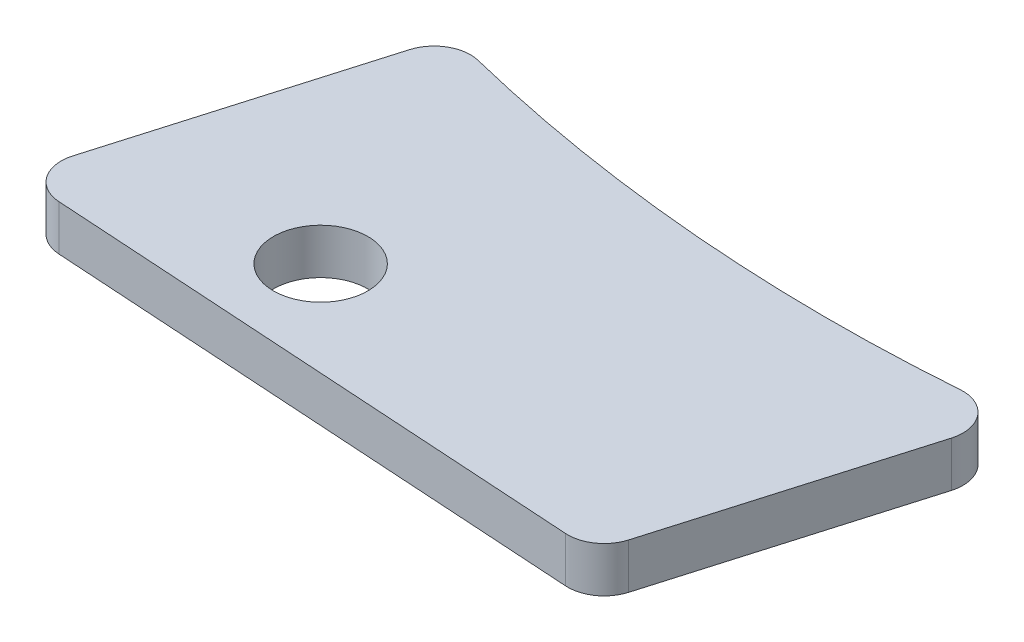
ISO-10303-21;
HEADER;
FILE_DESCRIPTION(('STEP AP214'),'2;1');
FILE_NAME('part.step','',(''),(''),'','','');
FILE_SCHEMA(('AUTOMOTIVE_DESIGN { 1 0 10303 214 1 1 1 1 }'));
ENDSEC;
DATA;
#1=APPLICATION_CONTEXT('core data for automotive mechanical design processes');
#2=APPLICATION_PROTOCOL_DEFINITION('international standard','automotive_design',2000,#1);
#3=PRODUCT_CONTEXT('',#1,'mechanical');
#4=PRODUCT('Part','Part','',(#3));
#5=PRODUCT_RELATED_PRODUCT_CATEGORY('part','',(#4));
#6=PRODUCT_DEFINITION_FORMATION('','',#4);
#7=PRODUCT_DEFINITION_CONTEXT('part definition',#1,'design');
#8=PRODUCT_DEFINITION('design','',#6,#7);
#9=PRODUCT_DEFINITION_SHAPE('','',#8);
#10=(LENGTH_UNIT() NAMED_UNIT(*) SI_UNIT(.MILLI.,.METRE.));
#11=(NAMED_UNIT(*) PLANE_ANGLE_UNIT() SI_UNIT($,.RADIAN.));
#12=(NAMED_UNIT(*) SI_UNIT($,.STERADIAN.) SOLID_ANGLE_UNIT());
#13=UNCERTAINTY_MEASURE_WITH_UNIT(LENGTH_MEASURE(1.E-05),#10,'distance_accuracy_value','');
#14=(GEOMETRIC_REPRESENTATION_CONTEXT(3) GLOBAL_UNCERTAINTY_ASSIGNED_CONTEXT((#13)) GLOBAL_UNIT_ASSIGNED_CONTEXT((#10,
#11,#12)) REPRESENTATION_CONTEXT('',''));
#15=CARTESIAN_POINT('',(0.,0.,0.));
#16=DIRECTION('',(0.,0.,1.));
#17=DIRECTION('',(1.,0.,0.));
#18=AXIS2_PLACEMENT_3D('',#15,#16,#17);
#19=CARTESIAN_POINT('',(-18.3348119627685,3.175,-9.66653198570461));
#20=DIRECTION('',(0.,1.,0.));
#21=DIRECTION('',(0.,0.,1.));
#22=AXIS2_PLACEMENT_3D('',#19,#20,#21);
#23=PLANE('',#22);
#24=DIRECTION('',(0.281289440008025,0.,-0.959622973328573));
#25=VECTOR('',#24,1.);
#26=CARTESIAN_POINT('',(-6.890929075773,3.175,109.775213463805));
#27=LINE('',#26,#25);
#28=CARTESIAN_POINT('',(-12.0471480478891,3.175,127.365728703247));
#29=VERTEX_POINT('',#28);
#30=CARTESIAN_POINT('',(-6.93500488791203,3.175,109.925578731323));
#31=VERTEX_POINT('',#30);
#32=EDGE_CURVE('E135',#29,#31,#27,.T.);
#33=ORIENTED_EDGE('',*,*,#32,.T.);
#34=CARTESIAN_POINT('',(-9.37244724016661,3.175,109.211103553703));
#35=DIRECTION('',(0.,1.,0.));
#36=DIRECTION('',(0.,0.,1.));
#37=AXIS2_PLACEMENT_3D('',#34,#35,#36);
#38=CIRCLE('',#37,2.54);
#39=CARTESIAN_POINT('',(-9.56339977470615,3.175,106.678291454562));
#40=VERTEX_POINT('',#39);
#41=EDGE_CURVE('E154',#31,#40,#38,.T.);
#42=ORIENTED_EDGE('',*,*,#41,.T.);
#43=CARTESIAN_POINT('',(-18.3348119627685,3.175,-9.66653198570461));
#44=DIRECTION('',(0.,-1.,0.));
#45=DIRECTION('',(0.,0.,1.));
#46=AXIS2_PLACEMENT_3D('',#43,#44,#45);
#47=CIRCLE('',#46,116.674999949088);
#48=CARTESIAN_POINT('',(-46.3534270147865,3.175,103.594285703762));
#49=VERTEX_POINT('',#48);
#50=EDGE_CURVE('E118',#40,#49,#47,.T.);
#51=ORIENTED_EDGE('',*,*,#50,.T.);
#52=CARTESIAN_POINT('',(-46.9633887226346,3.175,106.059959387557));
#53=DIRECTION('',(0.,1.,0.));
#54=DIRECTION('',(0.,0.,1.));
#55=AXIS2_PLACEMENT_3D('',#52,#53,#54);
#56=CIRCLE('',#55,2.54);
#57=CARTESIAN_POINT('',(-49.4008310748892,3.175,105.345484209936));
#58=VERTEX_POINT('',#57);
#59=EDGE_CURVE('E152',#49,#58,#56,.T.);
#60=ORIENTED_EDGE('',*,*,#59,.T.);
#61=DIRECTION('',(-0.281289440008026,0.,0.959622973328573));
#62=VECTOR('',#61,1.);
#63=CARTESIAN_POINT('',(-48.7090370703157,3.175,102.985419005993));
#64=LINE('',#63,#62);
#65=CARTESIAN_POINT('',(-54.7380726961309,3.175,123.553560822421));
#66=VERTEX_POINT('',#65);
#67=EDGE_CURVE('E174',#58,#66,#64,.T.);
#68=ORIENTED_EDGE('',*,*,#67,.T.);
#69=CARTESIAN_POINT('',(-52.3006303438763,3.175,124.268036000041));
#70=DIRECTION('',(0.,1.,0.));
#71=DIRECTION('',(0.,0.,1.));
#72=AXIS2_PLACEMENT_3D('',#69,#70,#71);
#73=CIRCLE('',#72,2.54);
#74=CARTESIAN_POINT('',(-52.4603876097414,3.175,126.803006930053));
#75=VERTEX_POINT('',#74);
#76=EDGE_CURVE('E53',#66,#75,#73,.T.);
#77=ORIENTED_EDGE('',*,*,#76,.T.);
#78=DIRECTION('',(0.998020051185627,0.,0.0628965613641808));
#79=VECTOR('',#78,1.);
#80=CARTESIAN_POINT('',(-12.6182098833549,3.175,129.313914374521));
#81=LINE('',#80,#79);
#82=CARTESIAN_POINT('',(-14.6443476660087,3.175,129.186224455638));
#83=VERTEX_POINT('',#82);
#84=EDGE_CURVE('E164',#75,#83,#81,.T.);
#85=ORIENTED_EDGE('',*,*,#84,.T.);
#86=CARTESIAN_POINT('',(-14.4845904001437,3.175,126.651253525627));
#87=DIRECTION('',(0.,1.,0.));
#88=DIRECTION('',(0.,0.,1.));
#89=AXIS2_PLACEMENT_3D('',#86,#87,#88);
#90=CIRCLE('',#89,2.54);
#91=EDGE_CURVE('E150',#83,#29,#90,.T.);
#92=ORIENTED_EDGE('',*,*,#91,.T.);
#93=EDGE_LOOP('',(#33,#42,#51,#60,#68,#77,#85,#92));
#94=FACE_BOUND('',#93,.T.);
#95=CARTESIAN_POINT('',(-39.5445796520944,3.175,121.411764721017));
#96=DIRECTION('',(0.,1.,0.));
#97=DIRECTION('',(0.,0.,1.));
#98=AXIS2_PLACEMENT_3D('',#95,#96,#97);
#99=CIRCLE('',#98,3.3);
#100=CARTESIAN_POINT('',(-39.5445796520944,3.175,124.711764721017));
#101=VERTEX_POINT('',#100);
#102=EDGE_CURVE('E126',#101,#101,#99,.T.);
#103=ORIENTED_EDGE('',*,*,#102,.F.);
#104=EDGE_LOOP('',(#103));
#105=FACE_BOUND('',#104,.T.);
#106=ADVANCED_FACE('F33',(#94,#105),#23,.T.);
#107=CARTESIAN_POINT('',(-18.3348119627685,0.,-9.66653198570461));
#108=DIRECTION('',(0.,1.,0.));
#109=DIRECTION('',(0.,0.,1.));
#110=AXIS2_PLACEMENT_3D('',#107,#108,#109);
#111=PLANE('',#110);
#112=CARTESIAN_POINT('',(-18.3348119627685,0.,-9.66653198570461));
#113=DIRECTION('',(0.,-1.,0.));
#114=DIRECTION('',(0.,0.,1.));
#115=AXIS2_PLACEMENT_3D('',#112,#113,#114);
#116=CIRCLE('',#115,116.674999949088);
#117=CARTESIAN_POINT('',(-9.56339977470615,0.,106.678291454562));
#118=VERTEX_POINT('',#117);
#119=CARTESIAN_POINT('',(-46.3534270147865,0.,103.594285703762));
#120=VERTEX_POINT('',#119);
#121=EDGE_CURVE('E115',#118,#120,#116,.T.);
#122=ORIENTED_EDGE('',*,*,#121,.F.);
#123=CARTESIAN_POINT('',(-9.37244724016661,0.,109.211103553703));
#124=DIRECTION('',(0.,1.,0.));
#125=DIRECTION('',(0.,0.,1.));
#126=AXIS2_PLACEMENT_3D('',#123,#124,#125);
#127=CIRCLE('',#126,2.54);
#128=CARTESIAN_POINT('',(-6.93500488791203,0.,109.925578731323));
#129=VERTEX_POINT('',#128);
#130=EDGE_CURVE('E98',#118,#129,#127,.F.);
#131=ORIENTED_EDGE('',*,*,#130,.T.);
#132=DIRECTION('',(0.281289440008026,0.,-0.959622973328573));
#133=VECTOR('',#132,1.);
#134=CARTESIAN_POINT('',(-5.88465666047091,0.,106.342300635214));
#135=LINE('',#134,#133);
#136=CARTESIAN_POINT('',(-12.0471480478891,0.,127.365728703247));
#137=VERTEX_POINT('',#136);
#138=EDGE_CURVE('E139',#137,#129,#135,.T.);
#139=ORIENTED_EDGE('',*,*,#138,.F.);
#140=CARTESIAN_POINT('',(-14.4845904001437,0.,126.651253525627));
#141=DIRECTION('',(0.,1.,0.));
#142=DIRECTION('',(0.,0.,1.));
#143=AXIS2_PLACEMENT_3D('',#140,#141,#142);
#144=CIRCLE('',#143,2.54);
#145=CARTESIAN_POINT('',(-14.6443476660087,0.,129.186224455638));
#146=VERTEX_POINT('',#145);
#147=EDGE_CURVE('E143',#137,#146,#144,.F.);
#148=ORIENTED_EDGE('',*,*,#147,.T.);
#149=DIRECTION('',(0.998020051185627,0.,0.0628965613641808));
#150=VECTOR('',#149,1.);
#151=CARTESIAN_POINT('',(-12.6182098833549,0.,129.313914374521));
#152=LINE('',#151,#150);
#153=CARTESIAN_POINT('',(-52.4603876097414,0.,126.803006930053));
#154=VERTEX_POINT('',#153);
#155=EDGE_CURVE('E129',#154,#146,#152,.T.);
#156=ORIENTED_EDGE('',*,*,#155,.F.);
#157=CARTESIAN_POINT('',(-52.3006303438763,0.,124.268036000041));
#158=DIRECTION('',(0.,1.,0.));
#159=DIRECTION('',(0.,0.,1.));
#160=AXIS2_PLACEMENT_3D('',#157,#158,#159);
#161=CIRCLE('',#160,2.54);
#162=CARTESIAN_POINT('',(-54.7380726961309,0.,123.553560822421));
#163=VERTEX_POINT('',#162);
#164=EDGE_CURVE('E119',#154,#163,#161,.F.);
#165=ORIENTED_EDGE('',*,*,#164,.T.);
#166=DIRECTION('',(-0.281289440008025,0.,0.959622973328573));
#167=VECTOR('',#166,1.);
#168=CARTESIAN_POINT('',(-49.6021310423411,0.,106.032221946311));
#169=LINE('',#168,#167);
#170=CARTESIAN_POINT('',(-49.4008310748892,0.,105.345484209936));
#171=VERTEX_POINT('',#170);
#172=EDGE_CURVE('E125',#171,#163,#169,.T.);
#173=ORIENTED_EDGE('',*,*,#172,.F.);
#174=CARTESIAN_POINT('',(-46.9633887226346,0.,106.059959387557));
#175=DIRECTION('',(0.,1.,0.));
#176=DIRECTION('',(0.,0.,1.));
#177=AXIS2_PLACEMENT_3D('',#174,#175,#176);
#178=CIRCLE('',#177,2.54);
#179=EDGE_CURVE('E109',#171,#120,#178,.F.);
#180=ORIENTED_EDGE('',*,*,#179,.T.);
#181=EDGE_LOOP('',(#122,#131,#139,#148,#156,#165,#173,#180));
#182=FACE_BOUND('',#181,.T.);
#183=CARTESIAN_POINT('',(-39.5445796520944,0.,121.411764721017));
#184=DIRECTION('',(0.,1.,0.));
#185=DIRECTION('',(0.,0.,1.));
#186=AXIS2_PLACEMENT_3D('',#183,#184,#185);
#187=CIRCLE('',#186,3.3);
#188=CARTESIAN_POINT('',(-39.5445796520944,0.,124.711764721017));
#189=VERTEX_POINT('',#188);
#190=EDGE_CURVE('E132',#189,#189,#187,.T.);
#191=ORIENTED_EDGE('',*,*,#190,.T.);
#192=EDGE_LOOP('',(#191));
#193=FACE_BOUND('',#192,.T.);
#194=ADVANCED_FACE('F122',(#182,#193),#111,.F.);
#195=CARTESIAN_POINT('',(-18.3348119627685,3.175,-9.66653198570461));
#196=DIRECTION('',(0.,-1.,0.));
#197=DIRECTION('',(0.,0.,-1.));
#198=AXIS2_PLACEMENT_3D('',#195,#196,#197);
#199=CYLINDRICAL_SURFACE('',#198,116.674999949088);
#200=ORIENTED_EDGE('',*,*,#50,.F.);
#201=DIRECTION('',(0.,-1.,0.));
#202=VECTOR('',#201,1.);
#203=CARTESIAN_POINT('',(-9.56339977470614,3.175,106.678291454562));
#204=LINE('',#203,#202);
#205=EDGE_CURVE('E102',#40,#118,#204,.T.);
#206=ORIENTED_EDGE('',*,*,#205,.T.);
#207=ORIENTED_EDGE('',*,*,#121,.T.);
#208=DIRECTION('',(0.,-1.,0.));
#209=VECTOR('',#208,1.);
#210=CARTESIAN_POINT('',(-46.3534270147865,3.175,103.594285703762));
#211=LINE('',#210,#209);
#212=EDGE_CURVE('E120',#120,#49,#211,.F.);
#213=ORIENTED_EDGE('',*,*,#212,.T.);
#214=EDGE_LOOP('',(#200,#206,#207,#213));
#215=FACE_BOUND('',#214,.T.);
#216=ADVANCED_FACE('F114',(#215),#199,.F.);
#217=CARTESIAN_POINT('',(-49.6021310423411,3.175,106.032221946311));
#218=DIRECTION('',(0.959622973328573,0.,0.281289440008025));
#219=DIRECTION('',(0.281289440008025,0.,-0.959622973328573));
#220=AXIS2_PLACEMENT_3D('',#217,#218,#219);
#221=PLANE('',#220);
#222=ORIENTED_EDGE('',*,*,#67,.F.);
#223=DIRECTION('',(0.,-1.,0.));
#224=VECTOR('',#223,1.);
#225=CARTESIAN_POINT('',(-49.4008310748892,3.175,105.345484209936));
#226=LINE('',#225,#224);
#227=EDGE_CURVE('E158',#58,#171,#226,.T.);
#228=ORIENTED_EDGE('',*,*,#227,.T.);
#229=ORIENTED_EDGE('',*,*,#172,.T.);
#230=DIRECTION('',(0.,-1.,0.));
#231=VECTOR('',#230,1.);
#232=CARTESIAN_POINT('',(-54.7380726961309,3.175,123.553560822421));
#233=LINE('',#232,#231);
#234=EDGE_CURVE('E156',#163,#66,#233,.F.);
#235=ORIENTED_EDGE('',*,*,#234,.T.);
#236=EDGE_LOOP('',(#222,#228,#229,#235));
#237=FACE_BOUND('',#236,.T.);
#238=ADVANCED_FACE('F202',(#237),#221,.F.);
#239=CARTESIAN_POINT('',(-12.6182098833549,3.175,129.313914374521));
#240=DIRECTION('',(0.0628965613641808,0.,-0.998020051185627));
#241=DIRECTION('',(-0.998020051185627,0.,-0.0628965613641808));
#242=AXIS2_PLACEMENT_3D('',#239,#240,#241);
#243=PLANE('',#242);
#244=ORIENTED_EDGE('',*,*,#155,.T.);
#245=DIRECTION('',(0.,-1.,0.));
#246=VECTOR('',#245,1.);
#247=CARTESIAN_POINT('',(-14.6443476660087,3.175,129.186224455638));
#248=LINE('',#247,#246);
#249=EDGE_CURVE('E11',#146,#83,#248,.F.);
#250=ORIENTED_EDGE('',*,*,#249,.T.);
#251=ORIENTED_EDGE('',*,*,#84,.F.);
#252=DIRECTION('',(0.,-1.,0.));
#253=VECTOR('',#252,1.);
#254=CARTESIAN_POINT('',(-52.4603876097414,3.175,126.803006930053));
#255=LINE('',#254,#253);
#256=EDGE_CURVE('E41',#75,#154,#255,.T.);
#257=ORIENTED_EDGE('',*,*,#256,.T.);
#258=EDGE_LOOP('',(#244,#250,#251,#257));
#259=FACE_BOUND('',#258,.T.);
#260=ADVANCED_FACE('F163',(#259),#243,.F.);
#261=CARTESIAN_POINT('',(-5.88465666047091,3.175,106.342300635214));
#262=DIRECTION('',(-0.959622973328573,0.,-0.281289440008026));
#263=DIRECTION('',(-0.281289440008026,0.,0.959622973328573));
#264=AXIS2_PLACEMENT_3D('',#261,#262,#263);
#265=PLANE('',#264);
#266=ORIENTED_EDGE('',*,*,#138,.T.);
#267=DIRECTION('',(0.,-1.,0.));
#268=VECTOR('',#267,1.);
#269=CARTESIAN_POINT('',(-6.93500488791203,3.175,109.925578731323));
#270=LINE('',#269,#268);
#271=EDGE_CURVE('E103',#129,#31,#270,.F.);
#272=ORIENTED_EDGE('',*,*,#271,.T.);
#273=ORIENTED_EDGE('',*,*,#32,.F.);
#274=DIRECTION('',(0.,-1.,0.));
#275=VECTOR('',#274,1.);
#276=CARTESIAN_POINT('',(-12.0471480478891,3.175,127.365728703247));
#277=LINE('',#276,#275);
#278=EDGE_CURVE('E108',#29,#137,#277,.T.);
#279=ORIENTED_EDGE('',*,*,#278,.T.);
#280=EDGE_LOOP('',(#266,#272,#273,#279));
#281=FACE_BOUND('',#280,.T.);
#282=ADVANCED_FACE('F172',(#281),#265,.F.);
#283=CARTESIAN_POINT('',(-39.5445796520944,3.175,121.411764721017));
#284=DIRECTION('',(0.,-1.,0.));
#285=DIRECTION('',(0.,0.,-1.));
#286=AXIS2_PLACEMENT_3D('',#283,#284,#285);
#287=CYLINDRICAL_SURFACE('',#286,3.3);
#288=ORIENTED_EDGE('',*,*,#102,.T.);
#289=EDGE_LOOP('',(#288));
#290=FACE_BOUND('',#289,.T.);
#291=ORIENTED_EDGE('',*,*,#190,.F.);
#292=EDGE_LOOP('',(#291));
#293=FACE_BOUND('',#292,.T.);
#294=ADVANCED_FACE('F181',(#290,#293),#287,.F.);
#295=CARTESIAN_POINT('',(-9.37244724016661,3.175,109.211103553703));
#296=DIRECTION('',(0.,-1.,0.));
#297=DIRECTION('',(0.,0.,-1.));
#298=AXIS2_PLACEMENT_3D('',#295,#296,#297);
#299=CYLINDRICAL_SURFACE('',#298,2.54);
#300=ORIENTED_EDGE('',*,*,#41,.F.);
#301=ORIENTED_EDGE('',*,*,#271,.F.);
#302=ORIENTED_EDGE('',*,*,#130,.F.);
#303=ORIENTED_EDGE('',*,*,#205,.F.);
#304=EDGE_LOOP('',(#300,#301,#302,#303));
#305=FACE_BOUND('',#304,.T.);
#306=ADVANCED_FACE('F101',(#305),#299,.T.);
#307=CARTESIAN_POINT('',(-46.9633887226346,3.175,106.059959387557));
#308=DIRECTION('',(0.,-1.,0.));
#309=DIRECTION('',(0.,0.,-1.));
#310=AXIS2_PLACEMENT_3D('',#307,#308,#309);
#311=CYLINDRICAL_SURFACE('',#310,2.54);
#312=ORIENTED_EDGE('',*,*,#59,.F.);
#313=ORIENTED_EDGE('',*,*,#212,.F.);
#314=ORIENTED_EDGE('',*,*,#179,.F.);
#315=ORIENTED_EDGE('',*,*,#227,.F.);
#316=EDGE_LOOP('',(#312,#313,#314,#315));
#317=FACE_BOUND('',#316,.T.);
#318=ADVANCED_FACE('F189',(#317),#311,.T.);
#319=CARTESIAN_POINT('',(-14.4845904001437,3.175,126.651253525627));
#320=DIRECTION('',(0.,-1.,0.));
#321=DIRECTION('',(0.,0.,-1.));
#322=AXIS2_PLACEMENT_3D('',#319,#320,#321);
#323=CYLINDRICAL_SURFACE('',#322,2.54);
#324=ORIENTED_EDGE('',*,*,#91,.F.);
#325=ORIENTED_EDGE('',*,*,#249,.F.);
#326=ORIENTED_EDGE('',*,*,#147,.F.);
#327=ORIENTED_EDGE('',*,*,#278,.F.);
#328=EDGE_LOOP('',(#324,#325,#326,#327));
#329=FACE_BOUND('',#328,.T.);
#330=ADVANCED_FACE('F169',(#329),#323,.T.);
#331=CARTESIAN_POINT('',(-52.3006303438763,3.175,124.268036000041));
#332=DIRECTION('',(0.,-1.,0.));
#333=DIRECTION('',(0.,0.,-1.));
#334=AXIS2_PLACEMENT_3D('',#331,#332,#333);
#335=CYLINDRICAL_SURFACE('',#334,2.54);
#336=ORIENTED_EDGE('',*,*,#76,.F.);
#337=ORIENTED_EDGE('',*,*,#234,.F.);
#338=ORIENTED_EDGE('',*,*,#164,.F.);
#339=ORIENTED_EDGE('',*,*,#256,.F.);
#340=EDGE_LOOP('',(#336,#337,#338,#339));
#341=FACE_BOUND('',#340,.T.);
#342=ADVANCED_FACE('F35',(#341),#335,.T.);
#343=CLOSED_SHELL('',(#106,#194,#216,#238,#260,#282,#294,#306,#318,#330,#342));
#344=MANIFOLD_SOLID_BREP('B2',#343);
#345=ADVANCED_BREP_SHAPE_REPRESENTATION('',(#18,#344),#14);
#346=SHAPE_DEFINITION_REPRESENTATION(#9,#345);
ENDSEC;
END-ISO-10303-21;
